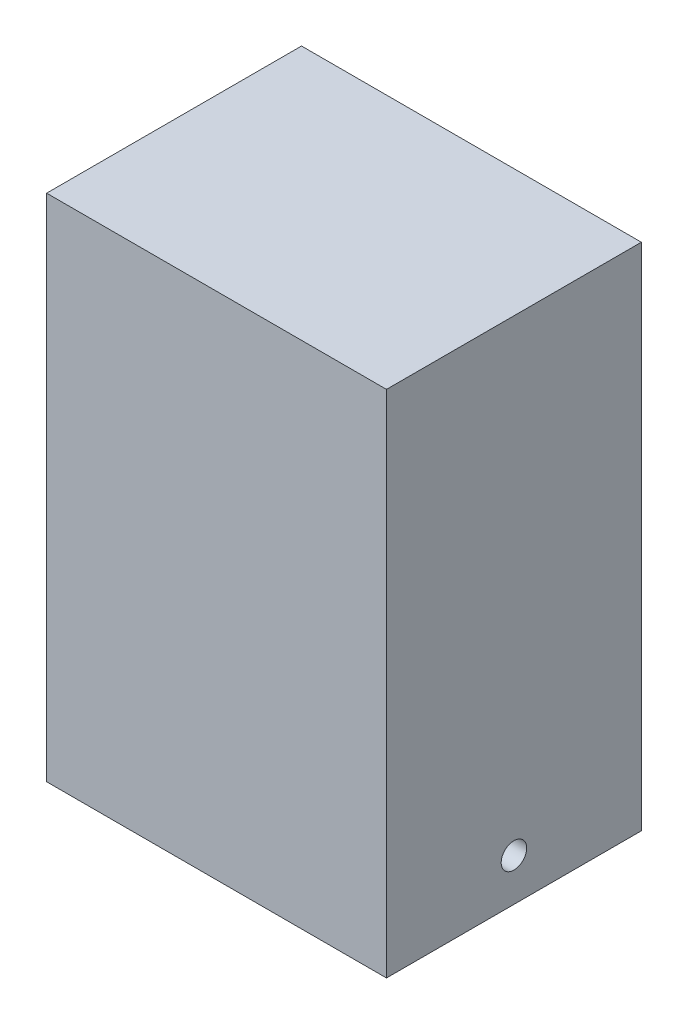
ISO-10303-21;
HEADER;
FILE_DESCRIPTION(('STEP AP214'),'2;1');
FILE_NAME('part.step','',(''),(''),'','','');
FILE_SCHEMA(('AUTOMOTIVE_DESIGN { 1 0 10303 214 1 1 1 1 }'));
ENDSEC;
DATA;
#1=APPLICATION_CONTEXT('core data for automotive mechanical design processes');
#2=APPLICATION_PROTOCOL_DEFINITION('international standard','automotive_design',2000,#1);
#3=PRODUCT_CONTEXT('',#1,'mechanical');
#4=PRODUCT('Part','Part','',(#3));
#5=PRODUCT_RELATED_PRODUCT_CATEGORY('part','',(#4));
#6=PRODUCT_DEFINITION_FORMATION('','',#4);
#7=PRODUCT_DEFINITION_CONTEXT('part definition',#1,'design');
#8=PRODUCT_DEFINITION('design','',#6,#7);
#9=PRODUCT_DEFINITION_SHAPE('','',#8);
#10=(LENGTH_UNIT() NAMED_UNIT(*) SI_UNIT(.MILLI.,.METRE.));
#11=(NAMED_UNIT(*) PLANE_ANGLE_UNIT() SI_UNIT($,.RADIAN.));
#12=(NAMED_UNIT(*) SI_UNIT($,.STERADIAN.) SOLID_ANGLE_UNIT());
#13=UNCERTAINTY_MEASURE_WITH_UNIT(LENGTH_MEASURE(1.E-05),#10,'distance_accuracy_value','');
#14=(GEOMETRIC_REPRESENTATION_CONTEXT(3) GLOBAL_UNCERTAINTY_ASSIGNED_CONTEXT((#13)) GLOBAL_UNIT_ASSIGNED_CONTEXT((#10,
#11,#12)) REPRESENTATION_CONTEXT('',''));
#15=CARTESIAN_POINT('',(0.,0.,0.));
#16=DIRECTION('',(0.,0.,1.));
#17=DIRECTION('',(1.,0.,0.));
#18=AXIS2_PLACEMENT_3D('',#15,#16,#17);
#19=CARTESIAN_POINT('',(20.,-30.,30.));
#20=DIRECTION('',(-1.,0.,0.));
#21=DIRECTION('',(0.,0.,1.));
#22=AXIS2_PLACEMENT_3D('',#19,#20,#21);
#23=PLANE('',#22);
#24=CARTESIAN_POINT('',(20.,-25.,15.));
#25=DIRECTION('',(1.,0.,0.));
#26=DIRECTION('',(0.,0.,-1.));
#27=AXIS2_PLACEMENT_3D('',#24,#25,#26);
#28=CIRCLE('',#27,1.5);
#29=CARTESIAN_POINT('',(20.,-25.,13.5));
#30=VERTEX_POINT('',#29);
#31=EDGE_CURVE('E115',#30,#30,#28,.T.);
#32=ORIENTED_EDGE('',*,*,#31,.F.);
#33=EDGE_LOOP('',(#32));
#34=FACE_BOUND('',#33,.T.);
#35=DIRECTION('',(0.,1.,0.));
#36=VECTOR('',#35,1.);
#37=CARTESIAN_POINT('',(20.,-30.,0.));
#38=LINE('',#37,#36);
#39=CARTESIAN_POINT('',(20.,-30.,0.));
#40=VERTEX_POINT('',#39);
#41=CARTESIAN_POINT('',(20.,30.,0.));
#42=VERTEX_POINT('',#41);
#43=EDGE_CURVE('E101',#40,#42,#38,.T.);
#44=ORIENTED_EDGE('',*,*,#43,.T.);
#45=DIRECTION('',(0.,0.,-1.));
#46=VECTOR('',#45,1.);
#47=CARTESIAN_POINT('',(20.,30.,30.));
#48=LINE('',#47,#46);
#49=CARTESIAN_POINT('',(20.,30.,30.));
#50=VERTEX_POINT('',#49);
#51=EDGE_CURVE('E11',#50,#42,#48,.T.);
#52=ORIENTED_EDGE('',*,*,#51,.F.);
#53=DIRECTION('',(0.,1.,0.));
#54=VECTOR('',#53,1.);
#55=CARTESIAN_POINT('',(20.,-30.,30.));
#56=LINE('',#55,#54);
#57=CARTESIAN_POINT('',(20.,-30.,30.));
#58=VERTEX_POINT('',#57);
#59=EDGE_CURVE('E89',#58,#50,#56,.T.);
#60=ORIENTED_EDGE('',*,*,#59,.F.);
#61=DIRECTION('',(0.,0.,-1.));
#62=VECTOR('',#61,1.);
#63=CARTESIAN_POINT('',(20.,-30.,30.));
#64=LINE('',#63,#62);
#65=EDGE_CURVE('E97',#58,#40,#64,.T.);
#66=ORIENTED_EDGE('',*,*,#65,.T.);
#67=EDGE_LOOP('',(#44,#52,#60,#66));
#68=FACE_BOUND('',#67,.T.);
#69=ADVANCED_FACE('F38',(#34,#68),#23,.F.);
#70=CARTESIAN_POINT('',(-20.,30.,30.));
#71=DIRECTION('',(0.,-1.,0.));
#72=DIRECTION('',(0.,0.,-1.));
#73=AXIS2_PLACEMENT_3D('',#70,#71,#72);
#74=PLANE('',#73);
#75=DIRECTION('',(-1.,0.,0.));
#76=VECTOR('',#75,1.);
#77=CARTESIAN_POINT('',(-20.,30.,0.));
#78=LINE('',#77,#76);
#79=CARTESIAN_POINT('',(-20.,30.,0.));
#80=VERTEX_POINT('',#79);
#81=EDGE_CURVE('E93',#42,#80,#78,.T.);
#82=ORIENTED_EDGE('',*,*,#81,.T.);
#83=DIRECTION('',(0.,0.,-1.));
#84=VECTOR('',#83,1.);
#85=CARTESIAN_POINT('',(-20.,30.,30.));
#86=LINE('',#85,#84);
#87=CARTESIAN_POINT('',(-20.,30.,30.));
#88=VERTEX_POINT('',#87);
#89=EDGE_CURVE('E46',#88,#80,#86,.T.);
#90=ORIENTED_EDGE('',*,*,#89,.F.);
#91=DIRECTION('',(-1.,0.,0.));
#92=VECTOR('',#91,1.);
#93=CARTESIAN_POINT('',(-20.,30.,30.));
#94=LINE('',#93,#92);
#95=EDGE_CURVE('E84',#50,#88,#94,.T.);
#96=ORIENTED_EDGE('',*,*,#95,.F.);
#97=ORIENTED_EDGE('',*,*,#51,.T.);
#98=EDGE_LOOP('',(#82,#90,#96,#97));
#99=FACE_BOUND('',#98,.T.);
#100=ADVANCED_FACE('F92',(#99),#74,.F.);
#101=CARTESIAN_POINT('',(-20.,-30.,30.));
#102=DIRECTION('',(1.,0.,0.));
#103=DIRECTION('',(0.,0.,-1.));
#104=AXIS2_PLACEMENT_3D('',#101,#102,#103);
#105=PLANE('',#104);
#106=CARTESIAN_POINT('',(-20.,-25.,15.));
#107=DIRECTION('',(1.,0.,0.));
#108=DIRECTION('',(0.,0.,-1.));
#109=AXIS2_PLACEMENT_3D('',#106,#107,#108);
#110=CIRCLE('',#109,1.5);
#111=CARTESIAN_POINT('',(-20.,-25.,13.5));
#112=VERTEX_POINT('',#111);
#113=EDGE_CURVE('E104',#112,#112,#110,.T.);
#114=ORIENTED_EDGE('',*,*,#113,.T.);
#115=EDGE_LOOP('',(#114));
#116=FACE_BOUND('',#115,.T.);
#117=DIRECTION('',(0.,-1.,0.));
#118=VECTOR('',#117,1.);
#119=CARTESIAN_POINT('',(-20.,-30.,0.));
#120=LINE('',#119,#118);
#121=CARTESIAN_POINT('',(-20.,-30.,0.));
#122=VERTEX_POINT('',#121);
#123=EDGE_CURVE('E71',#80,#122,#120,.T.);
#124=ORIENTED_EDGE('',*,*,#123,.T.);
#125=DIRECTION('',(0.,0.,-1.));
#126=VECTOR('',#125,1.);
#127=CARTESIAN_POINT('',(-20.,-30.,30.));
#128=LINE('',#127,#126);
#129=CARTESIAN_POINT('',(-20.,-30.,30.));
#130=VERTEX_POINT('',#129);
#131=EDGE_CURVE('E94',#130,#122,#128,.T.);
#132=ORIENTED_EDGE('',*,*,#131,.F.);
#133=DIRECTION('',(0.,-1.,0.));
#134=VECTOR('',#133,1.);
#135=CARTESIAN_POINT('',(-20.,-30.,30.));
#136=LINE('',#135,#134);
#137=EDGE_CURVE('E87',#88,#130,#136,.T.);
#138=ORIENTED_EDGE('',*,*,#137,.F.);
#139=ORIENTED_EDGE('',*,*,#89,.T.);
#140=EDGE_LOOP('',(#124,#132,#138,#139));
#141=FACE_BOUND('',#140,.T.);
#142=ADVANCED_FACE('F95',(#116,#141),#105,.F.);
#143=CARTESIAN_POINT('',(-20.,-30.,30.));
#144=DIRECTION('',(0.,1.,0.));
#145=DIRECTION('',(0.,0.,1.));
#146=AXIS2_PLACEMENT_3D('',#143,#144,#145);
#147=PLANE('',#146);
#148=DIRECTION('',(1.,0.,0.));
#149=VECTOR('',#148,1.);
#150=CARTESIAN_POINT('',(-20.,-30.,0.));
#151=LINE('',#150,#149);
#152=EDGE_CURVE('E77',#122,#40,#151,.T.);
#153=ORIENTED_EDGE('',*,*,#152,.T.);
#154=ORIENTED_EDGE('',*,*,#65,.F.);
#155=DIRECTION('',(1.,0.,0.));
#156=VECTOR('',#155,1.);
#157=CARTESIAN_POINT('',(-20.,-30.,30.));
#158=LINE('',#157,#156);
#159=EDGE_CURVE('E54',#130,#58,#158,.T.);
#160=ORIENTED_EDGE('',*,*,#159,.F.);
#161=ORIENTED_EDGE('',*,*,#131,.T.);
#162=EDGE_LOOP('',(#153,#154,#160,#161));
#163=FACE_BOUND('',#162,.T.);
#164=ADVANCED_FACE('F109',(#163),#147,.F.);
#165=CARTESIAN_POINT('',(0.,0.,30.));
#166=DIRECTION('',(0.,0.,-1.));
#167=DIRECTION('',(-1.,0.,0.));
#168=AXIS2_PLACEMENT_3D('',#165,#166,#167);
#169=PLANE('',#168);
#170=ORIENTED_EDGE('',*,*,#59,.T.);
#171=ORIENTED_EDGE('',*,*,#95,.T.);
#172=ORIENTED_EDGE('',*,*,#137,.T.);
#173=ORIENTED_EDGE('',*,*,#159,.T.);
#174=EDGE_LOOP('',(#170,#171,#172,#173));
#175=FACE_BOUND('',#174,.T.);
#176=ADVANCED_FACE('F85',(#175),#169,.F.);
#177=CARTESIAN_POINT('',(0.,0.,0.));
#178=DIRECTION('',(0.,0.,-1.));
#179=DIRECTION('',(-1.,0.,0.));
#180=AXIS2_PLACEMENT_3D('',#177,#178,#179);
#181=PLANE('',#180);
#182=ORIENTED_EDGE('',*,*,#43,.F.);
#183=ORIENTED_EDGE('',*,*,#152,.F.);
#184=ORIENTED_EDGE('',*,*,#123,.F.);
#185=ORIENTED_EDGE('',*,*,#81,.F.);
#186=EDGE_LOOP('',(#182,#183,#184,#185));
#187=FACE_BOUND('',#186,.T.);
#188=ADVANCED_FACE('F112',(#187),#181,.T.);
#189=CARTESIAN_POINT('',(-20.,-25.,15.));
#190=DIRECTION('',(1.,0.,0.));
#191=DIRECTION('',(0.,0.,-1.));
#192=AXIS2_PLACEMENT_3D('',#189,#190,#191);
#193=CYLINDRICAL_SURFACE('',#192,1.5);
#194=ORIENTED_EDGE('',*,*,#113,.F.);
#195=EDGE_LOOP('',(#194));
#196=FACE_BOUND('',#195,.T.);
#197=ORIENTED_EDGE('',*,*,#31,.T.);
#198=EDGE_LOOP('',(#197));
#199=FACE_BOUND('',#198,.T.);
#200=ADVANCED_FACE('F122',(#196,#199),#193,.F.);
#201=CLOSED_SHELL('',(#69,#100,#142,#164,#176,#188,#200));
#202=MANIFOLD_SOLID_BREP('B2',#201);
#203=ADVANCED_BREP_SHAPE_REPRESENTATION('',(#18,#202),#14);
#204=SHAPE_DEFINITION_REPRESENTATION(#9,#203);
ENDSEC;
END-ISO-10303-21;
